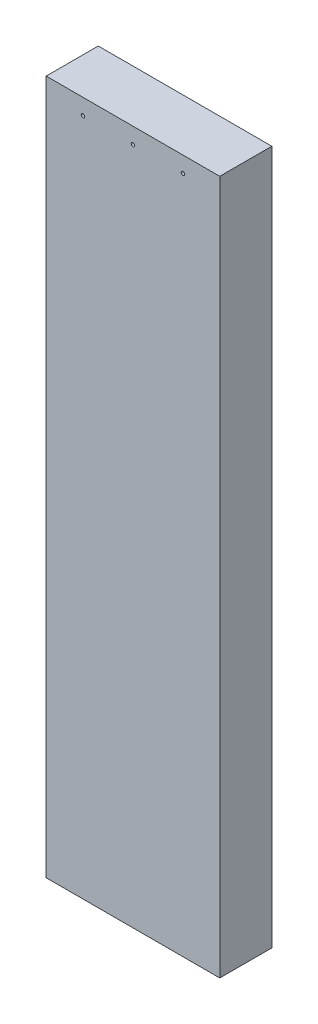
ISO-10303-21;
HEADER;
FILE_DESCRIPTION(('STEP AP214'),'2;1');
FILE_NAME('part.step','',(''),(''),'','','');
FILE_SCHEMA(('AUTOMOTIVE_DESIGN { 1 0 10303 214 1 1 1 1 }'));
ENDSEC;
DATA;
#1=APPLICATION_CONTEXT('core data for automotive mechanical design processes');
#2=APPLICATION_PROTOCOL_DEFINITION('international standard','automotive_design',2000,#1);
#3=PRODUCT_CONTEXT('',#1,'mechanical');
#4=PRODUCT('Part','Part','',(#3));
#5=PRODUCT_RELATED_PRODUCT_CATEGORY('part','',(#4));
#6=PRODUCT_DEFINITION_FORMATION('','',#4);
#7=PRODUCT_DEFINITION_CONTEXT('part definition',#1,'design');
#8=PRODUCT_DEFINITION('design','',#6,#7);
#9=PRODUCT_DEFINITION_SHAPE('','',#8);
#10=(LENGTH_UNIT() NAMED_UNIT(*) SI_UNIT(.MILLI.,.METRE.));
#11=(NAMED_UNIT(*) PLANE_ANGLE_UNIT() SI_UNIT($,.RADIAN.));
#12=(NAMED_UNIT(*) SI_UNIT($,.STERADIAN.) SOLID_ANGLE_UNIT());
#13=UNCERTAINTY_MEASURE_WITH_UNIT(LENGTH_MEASURE(1.E-05),#10,'distance_accuracy_value','');
#14=(GEOMETRIC_REPRESENTATION_CONTEXT(3) GLOBAL_UNCERTAINTY_ASSIGNED_CONTEXT((#13)) GLOBAL_UNIT_ASSIGNED_CONTEXT((#10,
#11,#12)) REPRESENTATION_CONTEXT('',''));
#15=CARTESIAN_POINT('',(0.,0.,0.));
#16=DIRECTION('',(0.,0.,1.));
#17=DIRECTION('',(1.,0.,0.));
#18=AXIS2_PLACEMENT_3D('',#15,#16,#17);
#19=CARTESIAN_POINT('',(0.,254.,0.));
#20=DIRECTION('',(1.,0.,0.));
#21=DIRECTION('',(0.,0.,-1.));
#22=AXIS2_PLACEMENT_3D('',#19,#20,#21);
#23=PLANE('',#22);
#24=DIRECTION('',(0.,0.,1.));
#25=VECTOR('',#24,1.);
#26=CARTESIAN_POINT('',(0.,0.,0.));
#27=LINE('',#26,#25);
#28=CARTESIAN_POINT('',(0.,0.,-19.05));
#29=VERTEX_POINT('',#28);
#30=CARTESIAN_POINT('',(0.,0.,0.));
#31=VERTEX_POINT('',#30);
#32=EDGE_CURVE('E102',#29,#31,#27,.T.);
#33=ORIENTED_EDGE('',*,*,#32,.T.);
#34=DIRECTION('',(0.,-1.,0.));
#35=VECTOR('',#34,1.);
#36=CARTESIAN_POINT('',(0.,254.,0.));
#37=LINE('',#36,#35);
#38=CARTESIAN_POINT('',(0.,254.,0.));
#39=VERTEX_POINT('',#38);
#40=EDGE_CURVE('E11',#39,#31,#37,.T.);
#41=ORIENTED_EDGE('',*,*,#40,.F.);
#42=DIRECTION('',(0.,0.,1.));
#43=VECTOR('',#42,1.);
#44=CARTESIAN_POINT('',(0.,254.,0.));
#45=LINE('',#44,#43);
#46=CARTESIAN_POINT('',(0.,254.,-19.05));
#47=VERTEX_POINT('',#46);
#48=EDGE_CURVE('E90',#47,#39,#45,.T.);
#49=ORIENTED_EDGE('',*,*,#48,.F.);
#50=DIRECTION('',(0.,-1.,0.));
#51=VECTOR('',#50,1.);
#52=CARTESIAN_POINT('',(0.,254.,-19.05));
#53=LINE('',#52,#51);
#54=EDGE_CURVE('E98',#47,#29,#53,.T.);
#55=ORIENTED_EDGE('',*,*,#54,.T.);
#56=EDGE_LOOP('',(#33,#41,#49,#55));
#57=FACE_BOUND('',#56,.T.);
#58=ADVANCED_FACE('F39',(#57),#23,.F.);
#59=CARTESIAN_POINT('',(0.,254.,0.));
#60=DIRECTION('',(0.,0.,-1.));
#61=DIRECTION('',(-1.,0.,0.));
#62=AXIS2_PLACEMENT_3D('',#59,#60,#61);
#63=PLANE('',#62);
#64=CARTESIAN_POINT('',(13.462,248.158,0.));
#65=DIRECTION('',(0.,0.,1.));
#66=DIRECTION('',(1.,0.,0.));
#67=AXIS2_PLACEMENT_3D('',#64,#65,#66);
#68=CIRCLE('',#67,0.634999999999985);
#69=CARTESIAN_POINT('',(14.097,248.158,0.));
#70=VERTEX_POINT('',#69);
#71=EDGE_CURVE('E128',#70,#70,#68,.T.);
#72=ORIENTED_EDGE('',*,*,#71,.F.);
#73=EDGE_LOOP('',(#72));
#74=FACE_BOUND('',#73,.T.);
#75=CARTESIAN_POINT('',(31.75,248.158,0.));
#76=DIRECTION('',(0.,0.,1.));
#77=DIRECTION('',(1.,0.,0.));
#78=AXIS2_PLACEMENT_3D('',#75,#76,#77);
#79=CIRCLE('',#78,0.634999999999966);
#80=CARTESIAN_POINT('',(32.385,248.158,0.));
#81=VERTEX_POINT('',#80);
#82=EDGE_CURVE('E125',#81,#81,#79,.T.);
#83=ORIENTED_EDGE('',*,*,#82,.F.);
#84=EDGE_LOOP('',(#83));
#85=FACE_BOUND('',#84,.T.);
#86=CARTESIAN_POINT('',(50.038,248.158,0.));
#87=DIRECTION('',(0.,0.,1.));
#88=DIRECTION('',(1.,0.,0.));
#89=AXIS2_PLACEMENT_3D('',#86,#87,#88);
#90=CIRCLE('',#89,0.634999999999966);
#91=CARTESIAN_POINT('',(50.673,248.158,0.));
#92=VERTEX_POINT('',#91);
#93=EDGE_CURVE('E119',#92,#92,#90,.T.);
#94=ORIENTED_EDGE('',*,*,#93,.F.);
#95=EDGE_LOOP('',(#94));
#96=FACE_BOUND('',#95,.T.);
#97=DIRECTION('',(1.,0.,0.));
#98=VECTOR('',#97,1.);
#99=CARTESIAN_POINT('',(0.,0.,0.));
#100=LINE('',#99,#98);
#101=CARTESIAN_POINT('',(63.5,0.,0.));
#102=VERTEX_POINT('',#101);
#103=EDGE_CURVE('E94',#31,#102,#100,.T.);
#104=ORIENTED_EDGE('',*,*,#103,.T.);
#105=DIRECTION('',(0.,-1.,0.));
#106=VECTOR('',#105,1.);
#107=CARTESIAN_POINT('',(63.5,254.,0.));
#108=LINE('',#107,#106);
#109=CARTESIAN_POINT('',(63.5,254.,0.));
#110=VERTEX_POINT('',#109);
#111=EDGE_CURVE('E47',#110,#102,#108,.T.);
#112=ORIENTED_EDGE('',*,*,#111,.F.);
#113=DIRECTION('',(1.,0.,0.));
#114=VECTOR('',#113,1.);
#115=CARTESIAN_POINT('',(0.,254.,0.));
#116=LINE('',#115,#114);
#117=EDGE_CURVE('E85',#39,#110,#116,.T.);
#118=ORIENTED_EDGE('',*,*,#117,.F.);
#119=ORIENTED_EDGE('',*,*,#40,.T.);
#120=EDGE_LOOP('',(#104,#112,#118,#119));
#121=FACE_BOUND('',#120,.T.);
#122=ADVANCED_FACE('F93',(#74,#85,#96,#121),#63,.F.);
#123=CARTESIAN_POINT('',(63.5,254.,0.));
#124=DIRECTION('',(-1.,0.,0.));
#125=DIRECTION('',(0.,0.,1.));
#126=AXIS2_PLACEMENT_3D('',#123,#124,#125);
#127=PLANE('',#126);
#128=DIRECTION('',(0.,0.,-1.));
#129=VECTOR('',#128,1.);
#130=CARTESIAN_POINT('',(63.5,0.,0.));
#131=LINE('',#130,#129);
#132=CARTESIAN_POINT('',(63.5,0.,-19.05));
#133=VERTEX_POINT('',#132);
#134=EDGE_CURVE('E72',#102,#133,#131,.T.);
#135=ORIENTED_EDGE('',*,*,#134,.T.);
#136=DIRECTION('',(0.,-1.,0.));
#137=VECTOR('',#136,1.);
#138=CARTESIAN_POINT('',(63.5,254.,-19.05));
#139=LINE('',#138,#137);
#140=CARTESIAN_POINT('',(63.5,254.,-19.05));
#141=VERTEX_POINT('',#140);
#142=EDGE_CURVE('E95',#141,#133,#139,.T.);
#143=ORIENTED_EDGE('',*,*,#142,.F.);
#144=DIRECTION('',(0.,0.,-1.));
#145=VECTOR('',#144,1.);
#146=CARTESIAN_POINT('',(63.5,254.,0.));
#147=LINE('',#146,#145);
#148=EDGE_CURVE('E88',#110,#141,#147,.T.);
#149=ORIENTED_EDGE('',*,*,#148,.F.);
#150=ORIENTED_EDGE('',*,*,#111,.T.);
#151=EDGE_LOOP('',(#135,#143,#149,#150));
#152=FACE_BOUND('',#151,.T.);
#153=ADVANCED_FACE('F96',(#152),#127,.F.);
#154=CARTESIAN_POINT('',(0.,254.,-19.05));
#155=DIRECTION('',(0.,0.,1.));
#156=DIRECTION('',(1.,0.,0.));
#157=AXIS2_PLACEMENT_3D('',#154,#155,#156);
#158=PLANE('',#157);
#159=CARTESIAN_POINT('',(13.462,248.158,-19.05));
#160=DIRECTION('',(0.,0.,1.));
#161=DIRECTION('',(1.,0.,0.));
#162=AXIS2_PLACEMENT_3D('',#159,#160,#161);
#163=CIRCLE('',#162,0.634999999999985);
#164=CARTESIAN_POINT('',(14.097,248.158,-19.05));
#165=VERTEX_POINT('',#164);
#166=EDGE_CURVE('E105',#165,#165,#163,.T.);
#167=ORIENTED_EDGE('',*,*,#166,.T.);
#168=EDGE_LOOP('',(#167));
#169=FACE_BOUND('',#168,.T.);
#170=CARTESIAN_POINT('',(31.75,248.158,-19.05));
#171=DIRECTION('',(0.,0.,1.));
#172=DIRECTION('',(1.,0.,0.));
#173=AXIS2_PLACEMENT_3D('',#170,#171,#172);
#174=CIRCLE('',#173,0.634999999999966);
#175=CARTESIAN_POINT('',(32.385,248.158,-19.05));
#176=VERTEX_POINT('',#175);
#177=EDGE_CURVE('E122',#176,#176,#174,.T.);
#178=ORIENTED_EDGE('',*,*,#177,.T.);
#179=EDGE_LOOP('',(#178));
#180=FACE_BOUND('',#179,.T.);
#181=CARTESIAN_POINT('',(50.038,248.158,-19.05));
#182=DIRECTION('',(0.,0.,1.));
#183=DIRECTION('',(1.,0.,0.));
#184=AXIS2_PLACEMENT_3D('',#181,#182,#183);
#185=CIRCLE('',#184,0.634999999999966);
#186=CARTESIAN_POINT('',(50.673,248.158,-19.05));
#187=VERTEX_POINT('',#186);
#188=EDGE_CURVE('E116',#187,#187,#185,.T.);
#189=ORIENTED_EDGE('',*,*,#188,.T.);
#190=EDGE_LOOP('',(#189));
#191=FACE_BOUND('',#190,.T.);
#192=DIRECTION('',(-1.,0.,0.));
#193=VECTOR('',#192,1.);
#194=CARTESIAN_POINT('',(0.,0.,-19.05));
#195=LINE('',#194,#193);
#196=EDGE_CURVE('E78',#133,#29,#195,.T.);
#197=ORIENTED_EDGE('',*,*,#196,.T.);
#198=ORIENTED_EDGE('',*,*,#54,.F.);
#199=DIRECTION('',(-1.,0.,0.));
#200=VECTOR('',#199,1.);
#201=CARTESIAN_POINT('',(0.,254.,-19.05));
#202=LINE('',#201,#200);
#203=EDGE_CURVE('E55',#141,#47,#202,.T.);
#204=ORIENTED_EDGE('',*,*,#203,.F.);
#205=ORIENTED_EDGE('',*,*,#142,.T.);
#206=EDGE_LOOP('',(#197,#198,#204,#205));
#207=FACE_BOUND('',#206,.T.);
#208=ADVANCED_FACE('F110',(#169,#180,#191,#207),#158,.F.);
#209=CARTESIAN_POINT('',(0.,254.,0.));
#210=DIRECTION('',(0.,-1.,0.));
#211=DIRECTION('',(0.,0.,-1.));
#212=AXIS2_PLACEMENT_3D('',#209,#210,#211);
#213=PLANE('',#212);
#214=ORIENTED_EDGE('',*,*,#48,.T.);
#215=ORIENTED_EDGE('',*,*,#117,.T.);
#216=ORIENTED_EDGE('',*,*,#148,.T.);
#217=ORIENTED_EDGE('',*,*,#203,.T.);
#218=EDGE_LOOP('',(#214,#215,#216,#217));
#219=FACE_BOUND('',#218,.T.);
#220=ADVANCED_FACE('F86',(#219),#213,.F.);
#221=CARTESIAN_POINT('',(0.,0.,0.));
#222=DIRECTION('',(0.,-1.,0.));
#223=DIRECTION('',(0.,0.,-1.));
#224=AXIS2_PLACEMENT_3D('',#221,#222,#223);
#225=PLANE('',#224);
#226=ORIENTED_EDGE('',*,*,#32,.F.);
#227=ORIENTED_EDGE('',*,*,#196,.F.);
#228=ORIENTED_EDGE('',*,*,#134,.F.);
#229=ORIENTED_EDGE('',*,*,#103,.F.);
#230=EDGE_LOOP('',(#226,#227,#228,#229));
#231=FACE_BOUND('',#230,.T.);
#232=ADVANCED_FACE('F113',(#231),#225,.T.);
#233=CARTESIAN_POINT('',(50.038,248.158,-19.05));
#234=DIRECTION('',(0.,0.,1.));
#235=DIRECTION('',(1.,0.,0.));
#236=AXIS2_PLACEMENT_3D('',#233,#234,#235);
#237=CYLINDRICAL_SURFACE('',#236,0.634999999999966);
#238=ORIENTED_EDGE('',*,*,#188,.F.);
#239=EDGE_LOOP('',(#238));
#240=FACE_BOUND('',#239,.T.);
#241=ORIENTED_EDGE('',*,*,#93,.T.);
#242=EDGE_LOOP('',(#241));
#243=FACE_BOUND('',#242,.T.);
#244=ADVANCED_FACE('F149',(#240,#243),#237,.F.);
#245=CARTESIAN_POINT('',(31.75,248.158,-19.05));
#246=DIRECTION('',(0.,0.,1.));
#247=DIRECTION('',(1.,0.,0.));
#248=AXIS2_PLACEMENT_3D('',#245,#246,#247);
#249=CYLINDRICAL_SURFACE('',#248,0.634999999999966);
#250=ORIENTED_EDGE('',*,*,#177,.F.);
#251=EDGE_LOOP('',(#250));
#252=FACE_BOUND('',#251,.T.);
#253=ORIENTED_EDGE('',*,*,#82,.T.);
#254=EDGE_LOOP('',(#253));
#255=FACE_BOUND('',#254,.T.);
#256=ADVANCED_FACE('F139',(#252,#255),#249,.F.);
#257=CARTESIAN_POINT('',(13.462,248.158,-19.05));
#258=DIRECTION('',(0.,0.,1.));
#259=DIRECTION('',(1.,0.,0.));
#260=AXIS2_PLACEMENT_3D('',#257,#258,#259);
#261=CYLINDRICAL_SURFACE('',#260,0.634999999999985);
#262=ORIENTED_EDGE('',*,*,#166,.F.);
#263=EDGE_LOOP('',(#262));
#264=FACE_BOUND('',#263,.T.);
#265=ORIENTED_EDGE('',*,*,#71,.T.);
#266=EDGE_LOOP('',(#265));
#267=FACE_BOUND('',#266,.T.);
#268=ADVANCED_FACE('F136',(#264,#267),#261,.F.);
#269=CLOSED_SHELL('',(#58,#122,#153,#208,#220,#232,#244,#256,#268));
#270=MANIFOLD_SOLID_BREP('B2',#269);
#271=ADVANCED_BREP_SHAPE_REPRESENTATION('',(#18,#270),#14);
#272=SHAPE_DEFINITION_REPRESENTATION(#9,#271);
ENDSEC;
END-ISO-10303-21;
